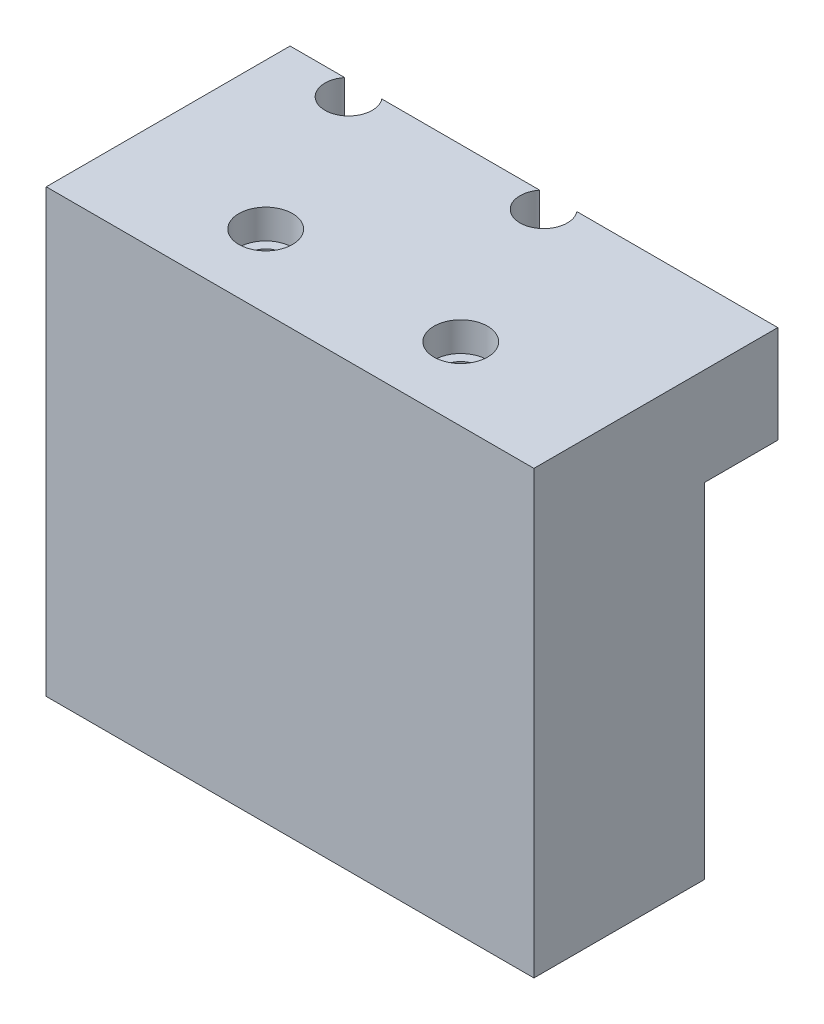
ISO-10303-21;
HEADER;
FILE_DESCRIPTION(('STEP AP214'),'2;1');
FILE_NAME('part.step','',(''),(''),'','','');
FILE_SCHEMA(('AUTOMOTIVE_DESIGN { 1 0 10303 214 1 1 1 1 }'));
ENDSEC;
DATA;
#1=APPLICATION_CONTEXT('core data for automotive mechanical design processes');
#2=APPLICATION_PROTOCOL_DEFINITION('international standard','automotive_design',2000,#1);
#3=PRODUCT_CONTEXT('',#1,'mechanical');
#4=PRODUCT('Part','Part','',(#3));
#5=PRODUCT_RELATED_PRODUCT_CATEGORY('part','',(#4));
#6=PRODUCT_DEFINITION_FORMATION('','',#4);
#7=PRODUCT_DEFINITION_CONTEXT('part definition',#1,'design');
#8=PRODUCT_DEFINITION('design','',#6,#7);
#9=PRODUCT_DEFINITION_SHAPE('','',#8);
#10=(LENGTH_UNIT() NAMED_UNIT(*) SI_UNIT(.MILLI.,.METRE.));
#11=(NAMED_UNIT(*) PLANE_ANGLE_UNIT() SI_UNIT($,.RADIAN.));
#12=(NAMED_UNIT(*) SI_UNIT($,.STERADIAN.) SOLID_ANGLE_UNIT());
#13=UNCERTAINTY_MEASURE_WITH_UNIT(LENGTH_MEASURE(1.E-05),#10,'distance_accuracy_value','');
#14=(GEOMETRIC_REPRESENTATION_CONTEXT(3) GLOBAL_UNCERTAINTY_ASSIGNED_CONTEXT((#13)) GLOBAL_UNIT_ASSIGNED_CONTEXT((#10,
#11,#12)) REPRESENTATION_CONTEXT('',''));
#15=CARTESIAN_POINT('',(0.,0.,0.));
#16=DIRECTION('',(0.,0.,1.));
#17=DIRECTION('',(1.,0.,0.));
#18=AXIS2_PLACEMENT_3D('',#15,#16,#17);
#19=CARTESIAN_POINT('',(0.,90.5,0.));
#20=DIRECTION('',(0.,0.,-1.));
#21=DIRECTION('',(-1.,0.,0.));
#22=AXIS2_PLACEMENT_3D('',#19,#20,#21);
#23=PLANE('',#22);
#24=DIRECTION('',(0.,1.,0.));
#25=VECTOR('',#24,1.);
#26=CARTESIAN_POINT('',(51.1891601975418,0.,0.));
#27=LINE('',#26,#25);
#28=CARTESIAN_POINT('',(51.1891601975418,70.5,0.));
#29=VERTEX_POINT('',#28);
#30=CARTESIAN_POINT('',(51.1891601975418,90.5,0.));
#31=VERTEX_POINT('',#30);
#32=EDGE_CURVE('E165',#29,#31,#27,.T.);
#33=ORIENTED_EDGE('',*,*,#32,.F.);
#34=DIRECTION('',(-1.,0.,0.));
#35=VECTOR('',#34,1.);
#36=CARTESIAN_POINT('',(100.,70.5,0.));
#37=LINE('',#36,#35);
#38=CARTESIAN_POINT('',(18.8108398024582,70.5,0.));
#39=VERTEX_POINT('',#38);
#40=EDGE_CURVE('E57',#29,#39,#37,.T.);
#41=ORIENTED_EDGE('',*,*,#40,.T.);
#42=DIRECTION('',(0.,1.,0.));
#43=VECTOR('',#42,1.);
#44=CARTESIAN_POINT('',(18.8108398024582,0.,0.));
#45=LINE('',#44,#43);
#46=CARTESIAN_POINT('',(18.8108398024582,90.5,0.));
#47=VERTEX_POINT('',#46);
#48=EDGE_CURVE('E170',#47,#39,#45,.F.);
#49=ORIENTED_EDGE('',*,*,#48,.F.);
#50=DIRECTION('',(-1.,0.,0.));
#51=VECTOR('',#50,1.);
#52=CARTESIAN_POINT('',(0.,90.5,0.));
#53=LINE('',#52,#51);
#54=EDGE_CURVE('E213',#31,#47,#53,.T.);
#55=ORIENTED_EDGE('',*,*,#54,.F.);
#56=EDGE_LOOP('',(#33,#41,#49,#55));
#57=FACE_BOUND('',#56,.T.);
#58=ADVANCED_FACE('F35',(#57),#23,.T.);
#59=DIRECTION('',(0.,1.,0.));
#60=VECTOR('',#59,1.);
#61=CARTESIAN_POINT('',(11.1891601975418,0.,0.));
#62=LINE('',#61,#60);
#63=CARTESIAN_POINT('',(11.1891601975418,70.5,0.));
#64=VERTEX_POINT('',#63);
#65=CARTESIAN_POINT('',(11.1891601975418,90.5,0.));
#66=VERTEX_POINT('',#65);
#67=EDGE_CURVE('E172',#64,#66,#62,.T.);
#68=ORIENTED_EDGE('',*,*,#67,.F.);
#69=CARTESIAN_POINT('',(0.,70.5,0.));
#70=VERTEX_POINT('',#69);
#71=EDGE_CURVE('E191',#64,#70,#37,.T.);
#72=ORIENTED_EDGE('',*,*,#71,.T.);
#73=DIRECTION('',(0.,-1.,0.));
#74=VECTOR('',#73,1.);
#75=CARTESIAN_POINT('',(0.,0.,0.));
#76=LINE('',#75,#74);
#77=CARTESIAN_POINT('',(0.,90.5,0.));
#78=VERTEX_POINT('',#77);
#79=EDGE_CURVE('E190',#78,#70,#76,.T.);
#80=ORIENTED_EDGE('',*,*,#79,.F.);
#81=EDGE_CURVE('E210',#66,#78,#53,.T.);
#82=ORIENTED_EDGE('',*,*,#81,.F.);
#83=EDGE_LOOP('',(#68,#72,#80,#82));
#84=FACE_BOUND('',#83,.T.);
#85=ADVANCED_FACE('F234',(#84),#23,.T.);
#86=CARTESIAN_POINT('',(0.,0.,50.));
#87=DIRECTION('',(1.,0.,0.));
#88=DIRECTION('',(0.,0.,-1.));
#89=AXIS2_PLACEMENT_3D('',#86,#87,#88);
#90=PLANE('',#89);
#91=CARTESIAN_POINT('',(0.,65.5,39.));
#92=DIRECTION('',(-1.,0.,0.));
#93=DIRECTION('',(0.,0.,1.));
#94=AXIS2_PLACEMENT_3D('',#91,#92,#93);
#95=CIRCLE('',#94,1.25);
#96=CARTESIAN_POINT('',(0.,65.5,40.25));
#97=VERTEX_POINT('',#96);
#98=EDGE_CURVE('E128',#97,#97,#95,.T.);
#99=ORIENTED_EDGE('',*,*,#98,.F.);
#100=EDGE_LOOP('',(#99));
#101=FACE_BOUND('',#100,.T.);
#102=CARTESIAN_POINT('',(0.,65.5,19.5));
#103=DIRECTION('',(-1.,0.,0.));
#104=DIRECTION('',(0.,0.,1.));
#105=AXIS2_PLACEMENT_3D('',#102,#103,#104);
#106=CIRCLE('',#105,1.25);
#107=CARTESIAN_POINT('',(0.,65.5,20.75));
#108=VERTEX_POINT('',#107);
#109=EDGE_CURVE('E127',#108,#108,#106,.T.);
#110=ORIENTED_EDGE('',*,*,#109,.F.);
#111=EDGE_LOOP('',(#110));
#112=FACE_BOUND('',#111,.T.);
#113=ORIENTED_EDGE('',*,*,#79,.T.);
#114=DIRECTION('',(0.,0.,-1.));
#115=VECTOR('',#114,1.);
#116=CARTESIAN_POINT('',(0.,70.5,0.));
#117=LINE('',#116,#115);
#118=CARTESIAN_POINT('',(0.,70.5,15.));
#119=VERTEX_POINT('',#118);
#120=EDGE_CURVE('E179',#119,#70,#117,.T.);
#121=ORIENTED_EDGE('',*,*,#120,.F.);
#122=DIRECTION('',(0.,1.,0.));
#123=VECTOR('',#122,1.);
#124=CARTESIAN_POINT('',(0.,0.,15.));
#125=LINE('',#124,#123);
#126=CARTESIAN_POINT('',(0.,0.,15.));
#127=VERTEX_POINT('',#126);
#128=EDGE_CURVE('E174',#127,#119,#125,.T.);
#129=ORIENTED_EDGE('',*,*,#128,.F.);
#130=DIRECTION('',(0.,0.,-1.));
#131=VECTOR('',#130,1.);
#132=CARTESIAN_POINT('',(0.,0.,50.));
#133=LINE('',#132,#131);
#134=CARTESIAN_POINT('',(0.,0.,50.));
#135=VERTEX_POINT('',#134);
#136=EDGE_CURVE('E222',#135,#127,#133,.T.);
#137=ORIENTED_EDGE('',*,*,#136,.F.);
#138=DIRECTION('',(0.,-1.,0.));
#139=VECTOR('',#138,1.);
#140=CARTESIAN_POINT('',(0.,0.,50.));
#141=LINE('',#140,#139);
#142=CARTESIAN_POINT('',(0.,90.5,50.));
#143=VERTEX_POINT('',#142);
#144=EDGE_CURVE('E195',#143,#135,#141,.T.);
#145=ORIENTED_EDGE('',*,*,#144,.F.);
#146=DIRECTION('',(0.,0.,-1.));
#147=VECTOR('',#146,1.);
#148=CARTESIAN_POINT('',(0.,90.5,50.));
#149=LINE('',#148,#147);
#150=EDGE_CURVE('E205',#143,#78,#149,.T.);
#151=ORIENTED_EDGE('',*,*,#150,.T.);
#152=EDGE_LOOP('',(#113,#121,#129,#137,#145,#151));
#153=FACE_BOUND('',#152,.T.);
#154=ADVANCED_FACE('F37',(#101,#112,#153),#90,.F.);
#155=CARTESIAN_POINT('',(0.,0.,50.));
#156=DIRECTION('',(0.,1.,0.));
#157=DIRECTION('',(0.,0.,1.));
#158=AXIS2_PLACEMENT_3D('',#155,#156,#157);
#159=PLANE('',#158);
#160=CARTESIAN_POINT('',(30.,0.,35.));
#161=DIRECTION('',(0.,1.,0.));
#162=DIRECTION('',(0.,0.,1.));
#163=AXIS2_PLACEMENT_3D('',#160,#161,#162);
#164=CIRCLE('',#163,3.49999999999998);
#165=CARTESIAN_POINT('',(30.,0.,38.5));
#166=VERTEX_POINT('',#165);
#167=EDGE_CURVE('E147',#166,#166,#164,.T.);
#168=ORIENTED_EDGE('',*,*,#167,.T.);
#169=EDGE_LOOP('',(#168));
#170=FACE_BOUND('',#169,.T.);
#171=CARTESIAN_POINT('',(70.,0.,35.));
#172=DIRECTION('',(0.,1.,0.));
#173=DIRECTION('',(0.,0.,1.));
#174=AXIS2_PLACEMENT_3D('',#171,#172,#173);
#175=CIRCLE('',#174,3.49999999999998);
#176=CARTESIAN_POINT('',(70.,0.,38.5));
#177=VERTEX_POINT('',#176);
#178=EDGE_CURVE('E159',#177,#177,#175,.T.);
#179=ORIENTED_EDGE('',*,*,#178,.T.);
#180=EDGE_LOOP('',(#179));
#181=FACE_BOUND('',#180,.T.);
#182=ORIENTED_EDGE('',*,*,#136,.T.);
#183=DIRECTION('',(-1.,0.,0.));
#184=VECTOR('',#183,1.);
#185=CARTESIAN_POINT('',(100.,0.,15.));
#186=LINE('',#185,#184);
#187=CARTESIAN_POINT('',(100.,0.,15.));
#188=VERTEX_POINT('',#187);
#189=EDGE_CURVE('E182',#188,#127,#186,.T.);
#190=ORIENTED_EDGE('',*,*,#189,.F.);
#191=DIRECTION('',(0.,0.,-1.));
#192=VECTOR('',#191,1.);
#193=CARTESIAN_POINT('',(100.,0.,50.));
#194=LINE('',#193,#192);
#195=CARTESIAN_POINT('',(100.,0.,50.));
#196=VERTEX_POINT('',#195);
#197=EDGE_CURVE('E219',#196,#188,#194,.T.);
#198=ORIENTED_EDGE('',*,*,#197,.F.);
#199=DIRECTION('',(1.,0.,0.));
#200=VECTOR('',#199,1.);
#201=CARTESIAN_POINT('',(0.,0.,50.));
#202=LINE('',#201,#200);
#203=EDGE_CURVE('E198',#135,#196,#202,.T.);
#204=ORIENTED_EDGE('',*,*,#203,.F.);
#205=EDGE_LOOP('',(#182,#190,#198,#204));
#206=FACE_BOUND('',#205,.T.);
#207=ADVANCED_FACE('F293',(#170,#181,#206),#159,.F.);
#208=CARTESIAN_POINT('',(100.,0.,50.));
#209=DIRECTION('',(-1.,0.,0.));
#210=DIRECTION('',(0.,0.,1.));
#211=AXIS2_PLACEMENT_3D('',#208,#209,#210);
#212=PLANE('',#211);
#213=DIRECTION('',(0.,1.,0.));
#214=VECTOR('',#213,1.);
#215=CARTESIAN_POINT('',(100.,0.,15.));
#216=LINE('',#215,#214);
#217=CARTESIAN_POINT('',(100.,70.5,15.));
#218=VERTEX_POINT('',#217);
#219=EDGE_CURVE('E175',#188,#218,#216,.T.);
#220=ORIENTED_EDGE('',*,*,#219,.T.);
#221=DIRECTION('',(0.,0.,-1.));
#222=VECTOR('',#221,1.);
#223=CARTESIAN_POINT('',(100.,70.5,0.));
#224=LINE('',#223,#222);
#225=CARTESIAN_POINT('',(100.,70.5,0.));
#226=VERTEX_POINT('',#225);
#227=EDGE_CURVE('E178',#218,#226,#224,.T.);
#228=ORIENTED_EDGE('',*,*,#227,.T.);
#229=DIRECTION('',(0.,1.,0.));
#230=VECTOR('',#229,1.);
#231=CARTESIAN_POINT('',(100.,0.,0.));
#232=LINE('',#231,#230);
#233=CARTESIAN_POINT('',(100.,90.5,0.));
#234=VERTEX_POINT('',#233);
#235=EDGE_CURVE('E208',#226,#234,#232,.T.);
#236=ORIENTED_EDGE('',*,*,#235,.T.);
#237=DIRECTION('',(0.,0.,-1.));
#238=VECTOR('',#237,1.);
#239=CARTESIAN_POINT('',(100.,90.5,50.));
#240=LINE('',#239,#238);
#241=CARTESIAN_POINT('',(100.,90.5,50.));
#242=VERTEX_POINT('',#241);
#243=EDGE_CURVE('E216',#242,#234,#240,.T.);
#244=ORIENTED_EDGE('',*,*,#243,.F.);
#245=DIRECTION('',(0.,1.,0.));
#246=VECTOR('',#245,1.);
#247=CARTESIAN_POINT('',(100.,0.,50.));
#248=LINE('',#247,#246);
#249=EDGE_CURVE('E201',#196,#242,#248,.T.);
#250=ORIENTED_EDGE('',*,*,#249,.F.);
#251=ORIENTED_EDGE('',*,*,#197,.T.);
#252=EDGE_LOOP('',(#220,#228,#236,#244,#250,#251));
#253=FACE_BOUND('',#252,.T.);
#254=ADVANCED_FACE('F265',(#253),#212,.F.);
#255=CARTESIAN_POINT('',(0.,90.5,50.));
#256=DIRECTION('',(0.,-1.,0.));
#257=DIRECTION('',(0.,0.,-1.));
#258=AXIS2_PLACEMENT_3D('',#255,#256,#257);
#259=PLANE('',#258);
#260=CARTESIAN_POINT('',(30.,90.5,35.));
#261=DIRECTION('',(0.,1.,0.));
#262=DIRECTION('',(0.,0.,1.));
#263=AXIS2_PLACEMENT_3D('',#260,#261,#262);
#264=CIRCLE('',#263,5.5);
#265=CARTESIAN_POINT('',(30.,90.5,40.5));
#266=VERTEX_POINT('',#265);
#267=EDGE_CURVE('E138',#266,#266,#264,.T.);
#268=ORIENTED_EDGE('',*,*,#267,.F.);
#269=EDGE_LOOP('',(#268));
#270=FACE_BOUND('',#269,.T.);
#271=CARTESIAN_POINT('',(70.,90.5,35.));
#272=DIRECTION('',(0.,1.,0.));
#273=DIRECTION('',(0.,0.,1.));
#274=AXIS2_PLACEMENT_3D('',#271,#272,#273);
#275=CIRCLE('',#274,5.50000000000001);
#276=CARTESIAN_POINT('',(70.,90.5,40.5));
#277=VERTEX_POINT('',#276);
#278=EDGE_CURVE('E150',#277,#277,#275,.T.);
#279=ORIENTED_EDGE('',*,*,#278,.F.);
#280=EDGE_LOOP('',(#279));
#281=FACE_BOUND('',#280,.T.);
#282=CARTESIAN_POINT('',(58.8108398024582,90.5,0.));
#283=VERTEX_POINT('',#282);
#284=EDGE_CURVE('E199',#234,#283,#53,.T.);
#285=ORIENTED_EDGE('',*,*,#284,.T.);
#286=CARTESIAN_POINT('',(55.,90.5,3.));
#287=DIRECTION('',(0.,1.,0.));
#288=DIRECTION('',(0.,0.,1.));
#289=AXIS2_PLACEMENT_3D('',#286,#287,#288);
#290=CIRCLE('',#289,4.85);
#291=EDGE_CURVE('E162',#31,#283,#290,.T.);
#292=ORIENTED_EDGE('',*,*,#291,.F.);
#293=ORIENTED_EDGE('',*,*,#54,.T.);
#294=CARTESIAN_POINT('',(15.,90.5,3.));
#295=DIRECTION('',(0.,1.,0.));
#296=DIRECTION('',(0.,0.,1.));
#297=AXIS2_PLACEMENT_3D('',#294,#295,#296);
#298=CIRCLE('',#297,4.85);
#299=EDGE_CURVE('E167',#66,#47,#298,.T.);
#300=ORIENTED_EDGE('',*,*,#299,.F.);
#301=ORIENTED_EDGE('',*,*,#81,.T.);
#302=ORIENTED_EDGE('',*,*,#150,.F.);
#303=DIRECTION('',(-1.,0.,0.));
#304=VECTOR('',#303,1.);
#305=CARTESIAN_POINT('',(0.,90.5,50.));
#306=LINE('',#305,#304);
#307=EDGE_CURVE('E203',#242,#143,#306,.T.);
#308=ORIENTED_EDGE('',*,*,#307,.F.);
#309=ORIENTED_EDGE('',*,*,#243,.T.);
#310=EDGE_LOOP('',(#285,#292,#293,#300,#301,#302,#308,#309));
#311=FACE_BOUND('',#310,.T.);
#312=ADVANCED_FACE('F240',(#270,#281,#311),#259,.F.);
#313=CARTESIAN_POINT('',(0.,90.5,50.));
#314=DIRECTION('',(0.,0.,-1.));
#315=DIRECTION('',(-1.,0.,0.));
#316=AXIS2_PLACEMENT_3D('',#313,#314,#315);
#317=PLANE('',#316);
#318=ORIENTED_EDGE('',*,*,#144,.T.);
#319=ORIENTED_EDGE('',*,*,#203,.T.);
#320=ORIENTED_EDGE('',*,*,#249,.T.);
#321=ORIENTED_EDGE('',*,*,#307,.T.);
#322=EDGE_LOOP('',(#318,#319,#320,#321));
#323=FACE_BOUND('',#322,.T.);
#324=ADVANCED_FACE('F250',(#323),#317,.F.);
#325=DIRECTION('',(0.,1.,0.));
#326=VECTOR('',#325,1.);
#327=CARTESIAN_POINT('',(58.8108398024582,0.,0.));
#328=LINE('',#327,#326);
#329=CARTESIAN_POINT('',(58.8108398024582,70.5,0.));
#330=VERTEX_POINT('',#329);
#331=EDGE_CURVE('E50',#283,#330,#328,.F.);
#332=ORIENTED_EDGE('',*,*,#331,.F.);
#333=ORIENTED_EDGE('',*,*,#284,.F.);
#334=ORIENTED_EDGE('',*,*,#235,.F.);
#335=EDGE_CURVE('E187',#226,#330,#37,.T.);
#336=ORIENTED_EDGE('',*,*,#335,.T.);
#337=EDGE_LOOP('',(#332,#333,#334,#336));
#338=FACE_BOUND('',#337,.T.);
#339=ADVANCED_FACE('F243',(#338),#23,.T.);
#340=CARTESIAN_POINT('',(100.,70.5,0.));
#341=DIRECTION('',(0.,1.,0.));
#342=DIRECTION('',(0.,0.,1.));
#343=AXIS2_PLACEMENT_3D('',#340,#341,#342);
#344=PLANE('',#343);
#345=ORIENTED_EDGE('',*,*,#40,.F.);
#346=CARTESIAN_POINT('',(55.,70.5,3.));
#347=DIRECTION('',(0.,1.,0.));
#348=DIRECTION('',(0.,0.,1.));
#349=AXIS2_PLACEMENT_3D('',#346,#347,#348);
#350=CIRCLE('',#349,4.85);
#351=EDGE_CURVE('E11',#29,#330,#350,.T.);
#352=ORIENTED_EDGE('',*,*,#351,.T.);
#353=ORIENTED_EDGE('',*,*,#335,.F.);
#354=ORIENTED_EDGE('',*,*,#227,.F.);
#355=DIRECTION('',(-1.,0.,0.));
#356=VECTOR('',#355,1.);
#357=CARTESIAN_POINT('',(100.,70.5,15.));
#358=LINE('',#357,#356);
#359=EDGE_CURVE('E192',#218,#119,#358,.T.);
#360=ORIENTED_EDGE('',*,*,#359,.T.);
#361=ORIENTED_EDGE('',*,*,#120,.T.);
#362=ORIENTED_EDGE('',*,*,#71,.F.);
#363=CARTESIAN_POINT('',(15.,70.5,3.));
#364=DIRECTION('',(0.,1.,0.));
#365=DIRECTION('',(0.,0.,1.));
#366=AXIS2_PLACEMENT_3D('',#363,#364,#365);
#367=CIRCLE('',#366,4.85);
#368=EDGE_CURVE('E43',#64,#39,#367,.T.);
#369=ORIENTED_EDGE('',*,*,#368,.T.);
#370=EDGE_LOOP('',(#345,#352,#353,#354,#360,#361,#362,#369));
#371=FACE_BOUND('',#370,.T.);
#372=ADVANCED_FACE('F227',(#371),#344,.F.);
#373=CARTESIAN_POINT('',(100.,0.,15.));
#374=DIRECTION('',(0.,0.,1.));
#375=DIRECTION('',(1.,0.,0.));
#376=AXIS2_PLACEMENT_3D('',#373,#374,#375);
#377=PLANE('',#376);
#378=ORIENTED_EDGE('',*,*,#128,.T.);
#379=ORIENTED_EDGE('',*,*,#359,.F.);
#380=ORIENTED_EDGE('',*,*,#219,.F.);
#381=ORIENTED_EDGE('',*,*,#189,.T.);
#382=EDGE_LOOP('',(#378,#379,#380,#381));
#383=FACE_BOUND('',#382,.T.);
#384=ADVANCED_FACE('F256',(#383),#377,.F.);
#385=CARTESIAN_POINT('',(15.,0.,3.));
#386=DIRECTION('',(0.,1.,0.));
#387=DIRECTION('',(0.,0.,1.));
#388=AXIS2_PLACEMENT_3D('',#385,#386,#387);
#389=CYLINDRICAL_SURFACE('',#388,4.85);
#390=ORIENTED_EDGE('',*,*,#67,.T.);
#391=ORIENTED_EDGE('',*,*,#299,.T.);
#392=ORIENTED_EDGE('',*,*,#48,.T.);
#393=ORIENTED_EDGE('',*,*,#368,.F.);
#394=EDGE_LOOP('',(#390,#391,#392,#393));
#395=FACE_BOUND('',#394,.T.);
#396=ADVANCED_FACE('F230',(#395),#389,.F.);
#397=CARTESIAN_POINT('',(55.,0.,3.));
#398=DIRECTION('',(0.,1.,0.));
#399=DIRECTION('',(0.,0.,1.));
#400=AXIS2_PLACEMENT_3D('',#397,#398,#399);
#401=CYLINDRICAL_SURFACE('',#400,4.85);
#402=ORIENTED_EDGE('',*,*,#32,.T.);
#403=ORIENTED_EDGE('',*,*,#291,.T.);
#404=ORIENTED_EDGE('',*,*,#331,.T.);
#405=ORIENTED_EDGE('',*,*,#351,.F.);
#406=EDGE_LOOP('',(#402,#403,#404,#405));
#407=FACE_BOUND('',#406,.T.);
#408=ADVANCED_FACE('F267',(#407),#401,.F.);
#409=CARTESIAN_POINT('',(70.,90.5,35.));
#410=DIRECTION('',(0.,1.,0.));
#411=DIRECTION('',(0.,0.,1.));
#412=AXIS2_PLACEMENT_3D('',#409,#410,#411);
#413=CYLINDRICAL_SURFACE('',#412,3.49999999999999);
#414=ORIENTED_EDGE('',*,*,#178,.F.);
#415=EDGE_LOOP('',(#414));
#416=FACE_BOUND('',#415,.T.);
#417=CARTESIAN_POINT('',(70.,84.5,35.));
#418=DIRECTION('',(0.,1.,0.));
#419=DIRECTION('',(0.,0.,1.));
#420=AXIS2_PLACEMENT_3D('',#417,#418,#419);
#421=CIRCLE('',#420,3.5);
#422=CARTESIAN_POINT('',(70.,84.5,38.5));
#423=VERTEX_POINT('',#422);
#424=EDGE_CURVE('E156',#423,#423,#421,.T.);
#425=ORIENTED_EDGE('',*,*,#424,.T.);
#426=EDGE_LOOP('',(#425));
#427=FACE_BOUND('',#426,.T.);
#428=ADVANCED_FACE('F269',(#416,#427),#413,.F.);
#429=CARTESIAN_POINT('',(73.5,84.5,35.));
#430=DIRECTION('',(0.,-1.,0.));
#431=DIRECTION('',(0.,0.,-1.));
#432=AXIS2_PLACEMENT_3D('',#429,#430,#431);
#433=PLANE('',#432);
#434=ORIENTED_EDGE('',*,*,#424,.F.);
#435=EDGE_LOOP('',(#434));
#436=FACE_BOUND('',#435,.T.);
#437=CARTESIAN_POINT('',(70.,84.5,35.));
#438=DIRECTION('',(0.,1.,0.));
#439=DIRECTION('',(0.,0.,1.));
#440=AXIS2_PLACEMENT_3D('',#437,#438,#439);
#441=CIRCLE('',#440,5.50000000000001);
#442=CARTESIAN_POINT('',(70.,84.5,40.5));
#443=VERTEX_POINT('',#442);
#444=EDGE_CURVE('E153',#443,#443,#441,.T.);
#445=ORIENTED_EDGE('',*,*,#444,.T.);
#446=EDGE_LOOP('',(#445));
#447=FACE_BOUND('',#446,.T.);
#448=ADVANCED_FACE('F275',(#436,#447),#433,.F.);
#449=CARTESIAN_POINT('',(70.,90.5,35.));
#450=DIRECTION('',(0.,1.,0.));
#451=DIRECTION('',(0.,0.,1.));
#452=AXIS2_PLACEMENT_3D('',#449,#450,#451);
#453=CYLINDRICAL_SURFACE('',#452,5.50000000000001);
#454=ORIENTED_EDGE('',*,*,#444,.F.);
#455=EDGE_LOOP('',(#454));
#456=FACE_BOUND('',#455,.T.);
#457=ORIENTED_EDGE('',*,*,#278,.T.);
#458=EDGE_LOOP('',(#457));
#459=FACE_BOUND('',#458,.T.);
#460=ADVANCED_FACE('F311',(#456,#459),#453,.F.);
#461=CARTESIAN_POINT('',(30.,90.5,35.));
#462=DIRECTION('',(0.,1.,0.));
#463=DIRECTION('',(0.,0.,1.));
#464=AXIS2_PLACEMENT_3D('',#461,#462,#463);
#465=CYLINDRICAL_SURFACE('',#464,3.49999999999999);
#466=ORIENTED_EDGE('',*,*,#167,.F.);
#467=EDGE_LOOP('',(#466));
#468=FACE_BOUND('',#467,.T.);
#469=CARTESIAN_POINT('',(30.,84.5,35.));
#470=DIRECTION('',(0.,1.,0.));
#471=DIRECTION('',(0.,0.,1.));
#472=AXIS2_PLACEMENT_3D('',#469,#470,#471);
#473=CIRCLE('',#472,3.50000000000001);
#474=CARTESIAN_POINT('',(30.,84.5,38.5));
#475=VERTEX_POINT('',#474);
#476=EDGE_CURVE('E144',#475,#475,#473,.T.);
#477=ORIENTED_EDGE('',*,*,#476,.T.);
#478=EDGE_LOOP('',(#477));
#479=FACE_BOUND('',#478,.T.);
#480=ADVANCED_FACE('F313',(#468,#479),#465,.F.);
#481=CARTESIAN_POINT('',(33.5,84.5,35.));
#482=DIRECTION('',(0.,-1.,0.));
#483=DIRECTION('',(0.,0.,-1.));
#484=AXIS2_PLACEMENT_3D('',#481,#482,#483);
#485=PLANE('',#484);
#486=ORIENTED_EDGE('',*,*,#476,.F.);
#487=EDGE_LOOP('',(#486));
#488=FACE_BOUND('',#487,.T.);
#489=CARTESIAN_POINT('',(30.,84.5,35.));
#490=DIRECTION('',(0.,1.,0.));
#491=DIRECTION('',(0.,0.,1.));
#492=AXIS2_PLACEMENT_3D('',#489,#490,#491);
#493=CIRCLE('',#492,5.5);
#494=CARTESIAN_POINT('',(30.,84.5,40.5));
#495=VERTEX_POINT('',#494);
#496=EDGE_CURVE('E141',#495,#495,#493,.T.);
#497=ORIENTED_EDGE('',*,*,#496,.T.);
#498=EDGE_LOOP('',(#497));
#499=FACE_BOUND('',#498,.T.);
#500=ADVANCED_FACE('F320',(#488,#499),#485,.F.);
#501=CARTESIAN_POINT('',(30.,90.5,35.));
#502=DIRECTION('',(0.,1.,0.));
#503=DIRECTION('',(0.,0.,1.));
#504=AXIS2_PLACEMENT_3D('',#501,#502,#503);
#505=CYLINDRICAL_SURFACE('',#504,5.5);
#506=ORIENTED_EDGE('',*,*,#496,.F.);
#507=EDGE_LOOP('',(#506));
#508=FACE_BOUND('',#507,.T.);
#509=ORIENTED_EDGE('',*,*,#267,.T.);
#510=EDGE_LOOP('',(#509));
#511=FACE_BOUND('',#510,.T.);
#512=ADVANCED_FACE('F328',(#508,#511),#505,.F.);
#513=CARTESIAN_POINT('',(7.5,65.5,19.5));
#514=DIRECTION('',(-1.,0.,0.));
#515=DIRECTION('',(0.,0.,1.));
#516=AXIS2_PLACEMENT_3D('',#513,#514,#515);
#517=CONICAL_SURFACE('',#516,1.25,1.02974425867665);
#518=CARTESIAN_POINT('',(8.25107577378445,65.5,19.5));
#519=VERTEX_POINT('',#518);
#520=VERTEX_LOOP('',#519);
#521=FACE_BOUND('',#520,.T.);
#522=CARTESIAN_POINT('',(7.5,65.5,19.5));
#523=DIRECTION('',(-1.,0.,0.));
#524=DIRECTION('',(0.,0.,1.));
#525=AXIS2_PLACEMENT_3D('',#522,#523,#524);
#526=CIRCLE('',#525,1.25);
#527=CARTESIAN_POINT('',(7.5,65.5,20.75));
#528=VERTEX_POINT('',#527);
#529=EDGE_CURVE('E131',#528,#528,#526,.T.);
#530=ORIENTED_EDGE('',*,*,#529,.T.);
#531=EDGE_LOOP('',(#530));
#532=FACE_BOUND('',#531,.T.);
#533=ADVANCED_FACE('F332',(#521,#532),#517,.F.);
#534=CARTESIAN_POINT('',(0.,65.5,19.5));
#535=DIRECTION('',(-1.,0.,0.));
#536=DIRECTION('',(0.,0.,1.));
#537=AXIS2_PLACEMENT_3D('',#534,#535,#536);
#538=CYLINDRICAL_SURFACE('',#537,1.25);
#539=ORIENTED_EDGE('',*,*,#529,.F.);
#540=EDGE_LOOP('',(#539));
#541=FACE_BOUND('',#540,.T.);
#542=ORIENTED_EDGE('',*,*,#109,.T.);
#543=EDGE_LOOP('',(#542));
#544=FACE_BOUND('',#543,.T.);
#545=ADVANCED_FACE('F121',(#541,#544),#538,.F.);
#546=CARTESIAN_POINT('',(7.5,65.5,39.));
#547=DIRECTION('',(-1.,0.,0.));
#548=DIRECTION('',(0.,0.,1.));
#549=AXIS2_PLACEMENT_3D('',#546,#547,#548);
#550=CONICAL_SURFACE('',#549,1.25,1.02974425867665);
#551=CARTESIAN_POINT('',(8.25107577378445,65.5,39.));
#552=VERTEX_POINT('',#551);
#553=VERTEX_LOOP('',#552);
#554=FACE_BOUND('',#553,.T.);
#555=CARTESIAN_POINT('',(7.5,65.5,39.));
#556=DIRECTION('',(-1.,0.,0.));
#557=DIRECTION('',(0.,0.,1.));
#558=AXIS2_PLACEMENT_3D('',#555,#556,#557);
#559=CIRCLE('',#558,1.25);
#560=CARTESIAN_POINT('',(7.5,65.5,40.25));
#561=VERTEX_POINT('',#560);
#562=EDGE_CURVE('E125',#561,#561,#559,.T.);
#563=ORIENTED_EDGE('',*,*,#562,.T.);
#564=EDGE_LOOP('',(#563));
#565=FACE_BOUND('',#564,.T.);
#566=ADVANCED_FACE('F117',(#554,#565),#550,.F.);
#567=CARTESIAN_POINT('',(0.,65.5,39.));
#568=DIRECTION('',(-1.,0.,0.));
#569=DIRECTION('',(0.,0.,1.));
#570=AXIS2_PLACEMENT_3D('',#567,#568,#569);
#571=CYLINDRICAL_SURFACE('',#570,1.25);
#572=ORIENTED_EDGE('',*,*,#562,.F.);
#573=EDGE_LOOP('',(#572));
#574=FACE_BOUND('',#573,.T.);
#575=ORIENTED_EDGE('',*,*,#98,.T.);
#576=EDGE_LOOP('',(#575));
#577=FACE_BOUND('',#576,.T.);
#578=ADVANCED_FACE('F120',(#574,#577),#571,.F.);
#579=CLOSED_SHELL('',(#58,#85,#154,#207,#254,#312,#324,#339,#372,#384,#396,#408,#428,#448,#460,
#480,#500,#512,#533,#545,#566,#578));
#580=MANIFOLD_SOLID_BREP('B2',#579);
#581=ADVANCED_BREP_SHAPE_REPRESENTATION('',(#18,#580),#14);
#582=SHAPE_DEFINITION_REPRESENTATION(#9,#581);
ENDSEC;
END-ISO-10303-21;
